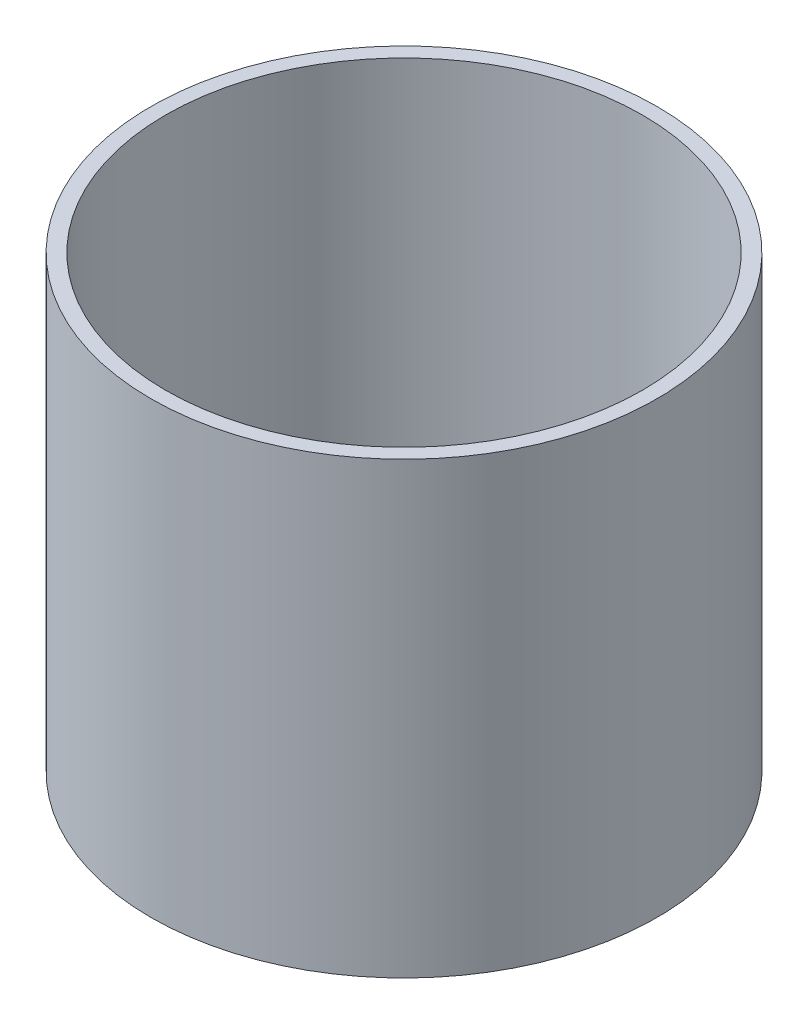
ISO-10303-21;
HEADER;
FILE_DESCRIPTION(('STEP AP214'),'2;1');
FILE_NAME('part.step','',(''),(''),'','','');
FILE_SCHEMA(('AUTOMOTIVE_DESIGN { 1 0 10303 214 1 1 1 1 }'));
ENDSEC;
DATA;
#1=APPLICATION_CONTEXT('core data for automotive mechanical design processes');
#2=APPLICATION_PROTOCOL_DEFINITION('international standard','automotive_design',2000,#1);
#3=PRODUCT_CONTEXT('',#1,'mechanical');
#4=PRODUCT('Part','Part','',(#3));
#5=PRODUCT_RELATED_PRODUCT_CATEGORY('part','',(#4));
#6=PRODUCT_DEFINITION_FORMATION('','',#4);
#7=PRODUCT_DEFINITION_CONTEXT('part definition',#1,'design');
#8=PRODUCT_DEFINITION('design','',#6,#7);
#9=PRODUCT_DEFINITION_SHAPE('','',#8);
#10=(LENGTH_UNIT() NAMED_UNIT(*) SI_UNIT(.MILLI.,.METRE.));
#11=(NAMED_UNIT(*) PLANE_ANGLE_UNIT() SI_UNIT($,.RADIAN.));
#12=(NAMED_UNIT(*) SI_UNIT($,.STERADIAN.) SOLID_ANGLE_UNIT());
#13=UNCERTAINTY_MEASURE_WITH_UNIT(LENGTH_MEASURE(1.E-05),#10,'distance_accuracy_value','');
#14=(GEOMETRIC_REPRESENTATION_CONTEXT(3) GLOBAL_UNCERTAINTY_ASSIGNED_CONTEXT((#13)) GLOBAL_UNIT_ASSIGNED_CONTEXT((#10,
#11,#12)) REPRESENTATION_CONTEXT('',''));
#15=CARTESIAN_POINT('',(0.,0.,0.));
#16=DIRECTION('',(0.,0.,1.));
#17=DIRECTION('',(1.,0.,0.));
#18=AXIS2_PLACEMENT_3D('',#15,#16,#17);
#19=CARTESIAN_POINT('',(103.1875,1524.,0.));
#20=DIRECTION('',(0.,-1.,0.));
#21=DIRECTION('',(0.,0.,-1.));
#22=AXIS2_PLACEMENT_3D('',#19,#20,#21);
#23=PLANE('',#22);
#24=CARTESIAN_POINT('',(0.,1524.,0.));
#25=DIRECTION('',(0.,-1.,0.));
#26=DIRECTION('',(0.,0.,-1.));
#27=AXIS2_PLACEMENT_3D('',#24,#25,#26);
#28=CIRCLE('',#27,109.5375);
#29=CARTESIAN_POINT('',(0.,1524.,-109.5375));
#30=VERTEX_POINT('',#29);
#31=EDGE_CURVE('E10',#30,#30,#28,.T.);
#32=ORIENTED_EDGE('',*,*,#31,.T.);
#33=EDGE_LOOP('',(#32));
#34=FACE_BOUND('',#33,.T.);
#35=CARTESIAN_POINT('',(0.,1524.,0.));
#36=DIRECTION('',(0.,-1.,0.));
#37=DIRECTION('',(0.,0.,-1.));
#38=AXIS2_PLACEMENT_3D('',#35,#36,#37);
#39=CIRCLE('',#38,103.1875);
#40=CARTESIAN_POINT('',(0.,1524.,-103.1875));
#41=VERTEX_POINT('',#40);
#42=EDGE_CURVE('E49',#41,#41,#39,.T.);
#43=ORIENTED_EDGE('',*,*,#42,.F.);
#44=EDGE_LOOP('',(#43));
#45=FACE_BOUND('',#44,.T.);
#46=ADVANCED_FACE('F35',(#34,#45),#23,.T.);
#47=CARTESIAN_POINT('',(0.,0.,0.));
#48=DIRECTION('',(0.,-1.,0.));
#49=DIRECTION('',(0.,0.,-1.));
#50=AXIS2_PLACEMENT_3D('',#47,#48,#49);
#51=CYLINDRICAL_SURFACE('',#50,109.5375);
#52=CARTESIAN_POINT('',(0.,1718.437,0.));
#53=DIRECTION('',(0.,-1.,0.));
#54=DIRECTION('',(0.,0.,-1.));
#55=AXIS2_PLACEMENT_3D('',#52,#53,#54);
#56=CIRCLE('',#55,109.5375);
#57=CARTESIAN_POINT('',(0.,1718.437,-109.5375));
#58=VERTEX_POINT('',#57);
#59=EDGE_CURVE('E41',#58,#58,#56,.T.);
#60=ORIENTED_EDGE('',*,*,#59,.T.);
#61=EDGE_LOOP('',(#60));
#62=FACE_BOUND('',#61,.T.);
#63=ORIENTED_EDGE('',*,*,#31,.F.);
#64=EDGE_LOOP('',(#63));
#65=FACE_BOUND('',#64,.T.);
#66=ADVANCED_FACE('F59',(#62,#65),#51,.T.);
#67=CARTESIAN_POINT('',(103.1875,1718.437,0.));
#68=DIRECTION('',(0.,1.,0.));
#69=DIRECTION('',(0.,0.,1.));
#70=AXIS2_PLACEMENT_3D('',#67,#68,#69);
#71=PLANE('',#70);
#72=CARTESIAN_POINT('',(0.,1718.437,0.));
#73=DIRECTION('',(0.,-1.,0.));
#74=DIRECTION('',(0.,0.,-1.));
#75=AXIS2_PLACEMENT_3D('',#72,#73,#74);
#76=CIRCLE('',#75,103.1875);
#77=CARTESIAN_POINT('',(0.,1718.437,-103.1875));
#78=VERTEX_POINT('',#77);
#79=EDGE_CURVE('E45',#78,#78,#76,.T.);
#80=ORIENTED_EDGE('',*,*,#79,.T.);
#81=EDGE_LOOP('',(#80));
#82=FACE_BOUND('',#81,.T.);
#83=ORIENTED_EDGE('',*,*,#59,.F.);
#84=EDGE_LOOP('',(#83));
#85=FACE_BOUND('',#84,.T.);
#86=ADVANCED_FACE('F63',(#82,#85),#71,.T.);
#87=CARTESIAN_POINT('',(0.,0.,0.));
#88=DIRECTION('',(0.,-1.,0.));
#89=DIRECTION('',(0.,0.,-1.));
#90=AXIS2_PLACEMENT_3D('',#87,#88,#89);
#91=CYLINDRICAL_SURFACE('',#90,103.1875);
#92=ORIENTED_EDGE('',*,*,#42,.T.);
#93=EDGE_LOOP('',(#92));
#94=FACE_BOUND('',#93,.T.);
#95=ORIENTED_EDGE('',*,*,#79,.F.);
#96=EDGE_LOOP('',(#95));
#97=FACE_BOUND('',#96,.T.);
#98=ADVANCED_FACE('F55',(#94,#97),#91,.F.);
#99=CLOSED_SHELL('',(#46,#66,#86,#98));
#100=MANIFOLD_SOLID_BREP('B2',#99);
#101=ADVANCED_BREP_SHAPE_REPRESENTATION('',(#18,#100),#14);
#102=SHAPE_DEFINITION_REPRESENTATION(#9,#101);
ENDSEC;
END-ISO-10303-21;
